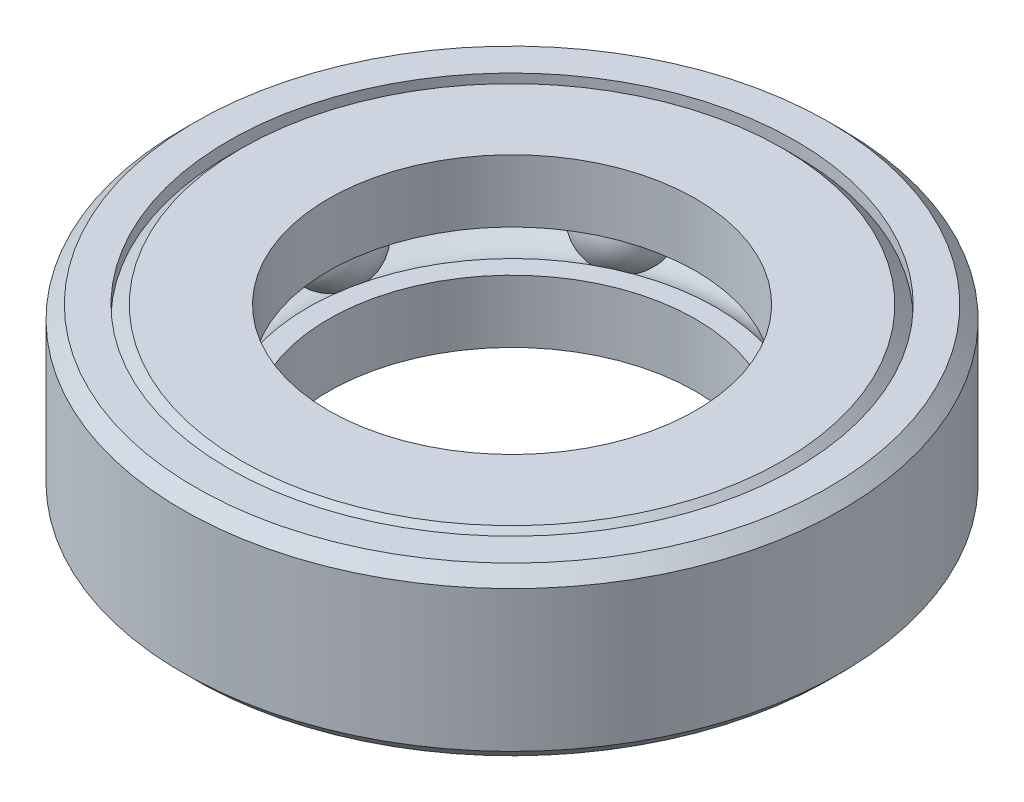
ISO-10303-21;
HEADER;
FILE_DESCRIPTION(('STEP AP214'),'2;1');
FILE_NAME('part.step','',(''),(''),'','','');
FILE_SCHEMA(('AUTOMOTIVE_DESIGN { 1 0 10303 214 1 1 1 1 }'));
ENDSEC;
DATA;
#1=APPLICATION_CONTEXT('core data for automotive mechanical design processes');
#2=APPLICATION_PROTOCOL_DEFINITION('international standard','automotive_design',2000,#1);
#3=PRODUCT_CONTEXT('',#1,'mechanical');
#4=PRODUCT('Part','Part','',(#3));
#5=PRODUCT_RELATED_PRODUCT_CATEGORY('part','',(#4));
#6=PRODUCT_DEFINITION_FORMATION('','',#4);
#7=PRODUCT_DEFINITION_CONTEXT('part definition',#1,'design');
#8=PRODUCT_DEFINITION('design','',#6,#7);
#9=PRODUCT_DEFINITION_SHAPE('','',#8);
#10=(LENGTH_UNIT() NAMED_UNIT(*) SI_UNIT(.MILLI.,.METRE.));
#11=(NAMED_UNIT(*) PLANE_ANGLE_UNIT() SI_UNIT($,.RADIAN.));
#12=(NAMED_UNIT(*) SI_UNIT($,.STERADIAN.) SOLID_ANGLE_UNIT());
#13=UNCERTAINTY_MEASURE_WITH_UNIT(LENGTH_MEASURE(1.E-05),#10,'distance_accuracy_value','');
#14=(GEOMETRIC_REPRESENTATION_CONTEXT(3) GLOBAL_UNCERTAINTY_ASSIGNED_CONTEXT((#13)) GLOBAL_UNIT_ASSIGNED_CONTEXT((#10,
#11,#12)) REPRESENTATION_CONTEXT('',''));
#15=CARTESIAN_POINT('',(0.,0.,0.));
#16=DIRECTION('',(0.,0.,1.));
#17=DIRECTION('',(1.,0.,0.));
#18=AXIS2_PLACEMENT_3D('',#15,#16,#17);
#19=CARTESIAN_POINT('',(17.8571532207388,0.,14.2406044947352));
#20=DIRECTION('',(0.,1.,0.));
#21=DIRECTION('',(-0.781831482468022,0.,-0.623489801858743));
#22=AXIS2_PLACEMENT_3D('',#19,#20,#21);
#23=SPHERICAL_SURFACE('',#22,3.96875);
#24=CARTESIAN_POINT('',(17.8571532207388,3.96875,14.2406044947352));
#25=VERTEX_POINT('',#24);
#26=VERTEX_LOOP('',#25);
#27=FACE_BOUND('',#26,.T.);
#28=ADVANCED_FACE('F35',(#27),#23,.T.);
#29=CLOSED_SHELL('',(#28));
#30=MANIFOLD_SOLID_BREP('B2',#29);
#31=CARTESIAN_POINT('',(22.2675058467192,0.,-5.08241290045794));
#32=DIRECTION('',(0.,1.,0.));
#33=DIRECTION('',(-0.974927912181826,0.,0.222520933956305));
#34=AXIS2_PLACEMENT_3D('',#31,#32,#33);
#35=SPHERICAL_SURFACE('',#34,3.96875);
#36=CARTESIAN_POINT('',(22.2675058467192,3.96875,-5.08241290045794));
#37=VERTEX_POINT('',#36);
#38=VERTEX_LOOP('',#37);
#39=FACE_BOUND('',#38,.T.);
#40=ADVANCED_FACE('F53',(#39),#35,.T.);
#41=CLOSED_SHELL('',(#40));
#42=MANIFOLD_SOLID_BREP('B6',#41);
#43=CARTESIAN_POINT('',(9.90997239577943,0.,-20.5782697192768));
#44=DIRECTION('',(0.,1.,0.));
#45=DIRECTION('',(-0.433883739117565,0.,0.900968867902416));
#46=AXIS2_PLACEMENT_3D('',#43,#44,#45);
#47=SPHERICAL_SURFACE('',#46,3.96875);
#48=CARTESIAN_POINT('',(9.90997239577943,3.96875000000001,-20.5782697192768));
#49=VERTEX_POINT('',#48);
#50=VERTEX_LOOP('',#49);
#51=FACE_BOUND('',#50,.T.);
#52=ADVANCED_FACE('F71',(#51),#47,.T.);
#53=CLOSED_SHELL('',(#52));
#54=MANIFOLD_SOLID_BREP('B31',#53);
#55=CARTESIAN_POINT('',(-9.90997239577914,0.,-20.5782697192769));
#56=DIRECTION('',(0.,1.,0.));
#57=DIRECTION('',(0.433883739117553,0.,0.900968867902422));
#58=AXIS2_PLACEMENT_3D('',#55,#56,#57);
#59=SPHERICAL_SURFACE('',#58,3.96875);
#60=CARTESIAN_POINT('',(-9.90997239577914,3.96875000000001,-20.5782697192769));
#61=VERTEX_POINT('',#60);
#62=VERTEX_LOOP('',#61);
#63=FACE_BOUND('',#62,.T.);
#64=ADVANCED_FACE('F89',(#63),#59,.T.);
#65=CLOSED_SHELL('',(#64));
#66=MANIFOLD_SOLID_BREP('B49',#65);
#67=CARTESIAN_POINT('',(-22.2675058467191,0.,-5.08241290045824));
#68=DIRECTION('',(0.,1.,0.));
#69=DIRECTION('',(0.974927912181823,0.,0.222520933956318));
#70=AXIS2_PLACEMENT_3D('',#67,#68,#69);
#71=SPHERICAL_SURFACE('',#70,3.96875);
#72=CARTESIAN_POINT('',(-22.2675058467191,3.96875,-5.08241290045824));
#73=VERTEX_POINT('',#72);
#74=VERTEX_LOOP('',#73);
#75=FACE_BOUND('',#74,.T.);
#76=ADVANCED_FACE('F107',(#75),#71,.T.);
#77=CLOSED_SHELL('',(#76));
#78=MANIFOLD_SOLID_BREP('B67',#77);
#79=CARTESIAN_POINT('',(-17.857153220739,0.,14.240604494735));
#80=DIRECTION('',(0.,1.,0.));
#81=DIRECTION('',(0.781831482468031,0.,-0.623489801858732));
#82=AXIS2_PLACEMENT_3D('',#79,#80,#81);
#83=SPHERICAL_SURFACE('',#82,3.96875);
#84=CARTESIAN_POINT('',(-17.857153220739,3.96875,14.240604494735));
#85=VERTEX_POINT('',#84);
#86=VERTEX_LOOP('',#85);
#87=FACE_BOUND('',#86,.T.);
#88=ADVANCED_FACE('F125',(#87),#83,.T.);
#89=CLOSED_SHELL('',(#88));
#90=MANIFOLD_SOLID_BREP('B85',#89);
#91=CARTESIAN_POINT('',(0.,0.,22.84015625));
#92=DIRECTION('',(0.,1.,0.));
#93=DIRECTION('',(0.,0.,-1.));
#94=AXIS2_PLACEMENT_3D('',#91,#92,#93);
#95=SPHERICAL_SURFACE('',#94,3.96875);
#96=CARTESIAN_POINT('',(0.,3.96875,22.84015625));
#97=VERTEX_POINT('',#96);
#98=VERTEX_LOOP('',#97);
#99=FACE_BOUND('',#98,.T.);
#100=ADVANCED_FACE('F145',(#99),#95,.T.);
#101=CLOSED_SHELL('',(#100));
#102=MANIFOLD_SOLID_BREP('B103',#101);
#103=CARTESIAN_POINT('',(0.,5.47163488649767,0.));
#104=DIRECTION('',(0.,-1.,0.));
#105=DIRECTION('',(0.,0.,-1.));
#106=AXIS2_PLACEMENT_3D('',#103,#104,#105);
#107=CONICAL_SURFACE('',#106,28.2178125,0.785398163397453);
#108=CARTESIAN_POINT('',(0.,6.70456744324884,0.));
#109=DIRECTION('',(0.,-1.,0.));
#110=DIRECTION('',(0.,0.,-1.));
#111=AXIS2_PLACEMENT_3D('',#108,#109,#110);
#112=CIRCLE('',#111,26.9848799432488);
#113=CARTESIAN_POINT('',(0.,6.70456744324884,-26.9848799432488));
#114=VERTEX_POINT('',#113);
#115=EDGE_CURVE('E144',#114,#114,#112,.T.);
#116=ORIENTED_EDGE('',*,*,#115,.F.);
#117=EDGE_LOOP('',(#116));
#118=FACE_BOUND('',#117,.T.);
#119=CARTESIAN_POINT('',(0.,5.47163488649767,0.));
#120=DIRECTION('',(0.,-1.,0.));
#121=DIRECTION('',(0.,0.,-1.));
#122=AXIS2_PLACEMENT_3D('',#119,#120,#121);
#123=CIRCLE('',#122,28.2178125);
#124=CARTESIAN_POINT('',(0.,5.47163488649768,-28.2178125));
#125=VERTEX_POINT('',#124);
#126=EDGE_CURVE('E199',#125,#125,#123,.T.);
#127=ORIENTED_EDGE('',*,*,#126,.T.);
#128=EDGE_LOOP('',(#127));
#129=FACE_BOUND('',#128,.T.);
#130=ADVANCED_FACE('F165',(#118,#129),#107,.F.);
#131=CARTESIAN_POINT('',(0.,-7.93750000000001,0.));
#132=DIRECTION('',(0.,-1.,0.));
#133=DIRECTION('',(0.,0.,-1.));
#134=AXIS2_PLACEMENT_3D('',#131,#132,#133);
#135=CYLINDRICAL_SURFACE('',#134,26.9848799432488);
#136=CARTESIAN_POINT('',(0.,7.9375,0.));
#137=DIRECTION('',(0.,-1.,0.));
#138=DIRECTION('',(0.,0.,-1.));
#139=AXIS2_PLACEMENT_3D('',#136,#137,#138);
#140=CIRCLE('',#139,26.9848799432488);
#141=CARTESIAN_POINT('',(0.,7.93750000000001,-26.9848799432488));
#142=VERTEX_POINT('',#141);
#143=EDGE_CURVE('E171',#142,#142,#140,.T.);
#144=ORIENTED_EDGE('',*,*,#143,.F.);
#145=EDGE_LOOP('',(#144));
#146=FACE_BOUND('',#145,.T.);
#147=ORIENTED_EDGE('',*,*,#115,.T.);
#148=EDGE_LOOP('',(#147));
#149=FACE_BOUND('',#148,.T.);
#150=ADVANCED_FACE('F248',(#146,#149),#135,.F.);
#151=CARTESIAN_POINT('',(0.,7.9375,30.1201924432488));
#152=DIRECTION('',(0.,-1.,0.));
#153=DIRECTION('',(0.,0.,-1.));
#154=AXIS2_PLACEMENT_3D('',#151,#152,#153);
#155=PLANE('',#154);
#156=CARTESIAN_POINT('',(0.,7.93750000000001,0.));
#157=DIRECTION('',(0.,-1.,0.));
#158=DIRECTION('',(0.,0.,-1.));
#159=AXIS2_PLACEMENT_3D('',#156,#157,#158);
#160=CIRCLE('',#159,30.1201924432488);
#161=CARTESIAN_POINT('',(0.,7.93750000000001,-30.1201924432488));
#162=VERTEX_POINT('',#161);
#163=EDGE_CURVE('E175',#162,#162,#160,.T.);
#164=ORIENTED_EDGE('',*,*,#163,.F.);
#165=EDGE_LOOP('',(#164));
#166=FACE_BOUND('',#165,.T.);
#167=ORIENTED_EDGE('',*,*,#143,.T.);
#168=EDGE_LOOP('',(#167));
#169=FACE_BOUND('',#168,.T.);
#170=ADVANCED_FACE('F243',(#166,#169),#155,.F.);
#171=CARTESIAN_POINT('',(0.,7.93750000000001,0.));
#172=DIRECTION('',(0.,-1.,0.));
#173=DIRECTION('',(0.,0.,-1.));
#174=AXIS2_PLACEMENT_3D('',#171,#172,#173);
#175=CONICAL_SURFACE('',#174,30.1201924432488,0.785398163397455);
#176=CARTESIAN_POINT('',(0.,6.70456744324884,0.));
#177=DIRECTION('',(0.,-1.,0.));
#178=DIRECTION('',(0.,0.,-1.));
#179=AXIS2_PLACEMENT_3D('',#176,#177,#178);
#180=CIRCLE('',#179,31.353125);
#181=CARTESIAN_POINT('',(0.,6.70456744324884,-31.353125));
#182=VERTEX_POINT('',#181);
#183=EDGE_CURVE('E179',#182,#182,#180,.T.);
#184=ORIENTED_EDGE('',*,*,#183,.F.);
#185=EDGE_LOOP('',(#184));
#186=FACE_BOUND('',#185,.T.);
#187=ORIENTED_EDGE('',*,*,#163,.T.);
#188=EDGE_LOOP('',(#187));
#189=FACE_BOUND('',#188,.T.);
#190=ADVANCED_FACE('F237',(#186,#189),#175,.T.);
#191=CARTESIAN_POINT('',(0.,-7.93750000000001,0.));
#192=DIRECTION('',(0.,-1.,0.));
#193=DIRECTION('',(0.,0.,-1.));
#194=AXIS2_PLACEMENT_3D('',#191,#192,#193);
#195=CYLINDRICAL_SURFACE('',#194,31.353125);
#196=CARTESIAN_POINT('',(0.,-6.70456744324885,0.));
#197=DIRECTION('',(0.,-1.,0.));
#198=DIRECTION('',(0.,0.,-1.));
#199=AXIS2_PLACEMENT_3D('',#196,#197,#198);
#200=CIRCLE('',#199,31.353125);
#201=CARTESIAN_POINT('',(0.,-6.70456744324885,-31.353125));
#202=VERTEX_POINT('',#201);
#203=EDGE_CURVE('E184',#202,#202,#200,.T.);
#204=ORIENTED_EDGE('',*,*,#203,.F.);
#205=EDGE_LOOP('',(#204));
#206=FACE_BOUND('',#205,.T.);
#207=ORIENTED_EDGE('',*,*,#183,.T.);
#208=EDGE_LOOP('',(#207));
#209=FACE_BOUND('',#208,.T.);
#210=ADVANCED_FACE('F231',(#206,#209),#195,.T.);
#211=CARTESIAN_POINT('',(0.,-6.70456744324885,0.));
#212=DIRECTION('',(0.,1.,0.));
#213=DIRECTION('',(0.,0.,1.));
#214=AXIS2_PLACEMENT_3D('',#211,#212,#213);
#215=CONICAL_SURFACE('',#214,31.353125,0.785398163397455);
#216=CARTESIAN_POINT('',(0.,-7.93750000000002,0.));
#217=DIRECTION('',(0.,-1.,0.));
#218=DIRECTION('',(0.,0.,-1.));
#219=AXIS2_PLACEMENT_3D('',#216,#217,#218);
#220=CIRCLE('',#219,30.1201924432488);
#221=CARTESIAN_POINT('',(0.,-7.93750000000002,-30.1201924432488));
#222=VERTEX_POINT('',#221);
#223=EDGE_CURVE('E187',#222,#222,#220,.T.);
#224=ORIENTED_EDGE('',*,*,#223,.F.);
#225=EDGE_LOOP('',(#224));
#226=FACE_BOUND('',#225,.T.);
#227=ORIENTED_EDGE('',*,*,#203,.T.);
#228=EDGE_LOOP('',(#227));
#229=FACE_BOUND('',#228,.T.);
#230=ADVANCED_FACE('F225',(#226,#229),#215,.T.);
#231=CARTESIAN_POINT('',(0.,-7.93750000000002,30.1201924432488));
#232=DIRECTION('',(0.,1.,0.));
#233=DIRECTION('',(0.,0.,1.));
#234=AXIS2_PLACEMENT_3D('',#231,#232,#233);
#235=PLANE('',#234);
#236=CARTESIAN_POINT('',(0.,-7.93750000000002,0.));
#237=DIRECTION('',(0.,-1.,0.));
#238=DIRECTION('',(0.,0.,-1.));
#239=AXIS2_PLACEMENT_3D('',#236,#237,#238);
#240=CIRCLE('',#239,26.9848799432488);
#241=CARTESIAN_POINT('',(0.,-7.93750000000001,-26.9848799432488));
#242=VERTEX_POINT('',#241);
#243=EDGE_CURVE('E190',#242,#242,#240,.T.);
#244=ORIENTED_EDGE('',*,*,#243,.F.);
#245=EDGE_LOOP('',(#244));
#246=FACE_BOUND('',#245,.T.);
#247=ORIENTED_EDGE('',*,*,#223,.T.);
#248=EDGE_LOOP('',(#247));
#249=FACE_BOUND('',#248,.T.);
#250=ADVANCED_FACE('F219',(#246,#249),#235,.F.);
#251=CARTESIAN_POINT('',(0.,-7.93750000000001,0.));
#252=DIRECTION('',(0.,-1.,0.));
#253=DIRECTION('',(0.,0.,-1.));
#254=AXIS2_PLACEMENT_3D('',#251,#252,#253);
#255=CYLINDRICAL_SURFACE('',#254,26.9848799432488);
#256=CARTESIAN_POINT('',(0.,-6.70456744324885,0.));
#257=DIRECTION('',(0.,-1.,0.));
#258=DIRECTION('',(0.,0.,-1.));
#259=AXIS2_PLACEMENT_3D('',#256,#257,#258);
#260=CIRCLE('',#259,26.9848799432488);
#261=CARTESIAN_POINT('',(0.,-6.70456744324885,-26.9848799432488));
#262=VERTEX_POINT('',#261);
#263=EDGE_CURVE('E193',#262,#262,#260,.T.);
#264=ORIENTED_EDGE('',*,*,#263,.F.);
#265=EDGE_LOOP('',(#264));
#266=FACE_BOUND('',#265,.T.);
#267=ORIENTED_EDGE('',*,*,#243,.T.);
#268=EDGE_LOOP('',(#267));
#269=FACE_BOUND('',#268,.T.);
#270=ADVANCED_FACE('F213',(#266,#269),#255,.F.);
#271=CARTESIAN_POINT('',(0.,-6.70456744324885,0.));
#272=DIRECTION('',(0.,1.,0.));
#273=DIRECTION('',(0.,0.,1.));
#274=AXIS2_PLACEMENT_3D('',#271,#272,#273);
#275=CONICAL_SURFACE('',#274,26.9848799432488,0.785398163397447);
#276=CARTESIAN_POINT('',(0.,-5.47163488649768,0.));
#277=DIRECTION('',(0.,-1.,0.));
#278=DIRECTION('',(0.,0.,-1.));
#279=AXIS2_PLACEMENT_3D('',#276,#277,#278);
#280=CIRCLE('',#279,28.2178125);
#281=CARTESIAN_POINT('',(0.,-5.47163488649767,-28.2178125));
#282=VERTEX_POINT('',#281);
#283=EDGE_CURVE('E196',#282,#282,#280,.T.);
#284=ORIENTED_EDGE('',*,*,#283,.F.);
#285=EDGE_LOOP('',(#284));
#286=FACE_BOUND('',#285,.T.);
#287=ORIENTED_EDGE('',*,*,#263,.T.);
#288=EDGE_LOOP('',(#287));
#289=FACE_BOUND('',#288,.T.);
#290=ADVANCED_FACE('F207',(#286,#289),#275,.F.);
#291=CARTESIAN_POINT('',(0.,-7.93750000000001,0.));
#292=DIRECTION('',(0.,-1.,0.));
#293=DIRECTION('',(0.,0.,-1.));
#294=AXIS2_PLACEMENT_3D('',#291,#292,#293);
#295=CYLINDRICAL_SURFACE('',#294,28.2178125);
#296=ORIENTED_EDGE('',*,*,#126,.F.);
#297=EDGE_LOOP('',(#296));
#298=FACE_BOUND('',#297,.T.);
#299=ORIENTED_EDGE('',*,*,#283,.T.);
#300=EDGE_LOOP('',(#299));
#301=FACE_BOUND('',#300,.T.);
#302=ADVANCED_FACE('F204',(#298,#301),#295,.F.);
#303=CLOSED_SHELL('',(#130,#150,#170,#190,#210,#230,#250,#270,#290,#302));
#304=MANIFOLD_SOLID_BREP('B121',#303);
#305=CARTESIAN_POINT('',(0.,0.,0.));
#306=DIRECTION('',(0.,-1.,0.));
#307=DIRECTION('',(0.,0.,-1.));
#308=AXIS2_PLACEMENT_3D('',#305,#306,#307);
#309=TOROIDAL_SURFACE('',#308,22.84015625,3.96875000000001);
#310=CARTESIAN_POINT('',(0.,-1.98437500000002,0.));
#311=DIRECTION('',(0.,-1.,0.));
#312=DIRECTION('',(0.,0.,-1.));
#313=AXIS2_PLACEMENT_3D('',#310,#311,#312);
#314=CIRCLE('',#313,26.2771945712695);
#315=CARTESIAN_POINT('',(0.,-1.98437500000001,-26.2771945712695));
#316=VERTEX_POINT('',#315);
#317=EDGE_CURVE('E164',#316,#316,#314,.T.);
#318=ORIENTED_EDGE('',*,*,#317,.F.);
#319=EDGE_LOOP('',(#318));
#320=FACE_BOUND('',#319,.T.);
#321=CARTESIAN_POINT('',(0.,-1.98437500000002,0.));
#322=DIRECTION('',(0.,-1.,0.));
#323=DIRECTION('',(0.,0.,-1.));
#324=AXIS2_PLACEMENT_3D('',#321,#322,#323);
#325=CIRCLE('',#324,19.4031179287305);
#326=CARTESIAN_POINT('',(0.,-1.98437500000001,-19.4031179287305));
#327=VERTEX_POINT('',#326);
#328=EDGE_CURVE('E348',#327,#327,#325,.T.);
#329=ORIENTED_EDGE('',*,*,#328,.T.);
#330=EDGE_LOOP('',(#329));
#331=FACE_BOUND('',#330,.T.);
#332=ADVANCED_FACE('F323',(#320,#331),#309,.F.);
#333=CARTESIAN_POINT('',(0.,-1.98437500000002,26.2771945712695));
#334=DIRECTION('',(0.,-1.,0.));
#335=DIRECTION('',(0.,0.,-1.));
#336=AXIS2_PLACEMENT_3D('',#333,#334,#335);
#337=PLANE('',#336);
#338=CARTESIAN_POINT('',(0.,-1.98437500000002,0.));
#339=DIRECTION('',(0.,-1.,0.));
#340=DIRECTION('',(0.,0.,-1.));
#341=AXIS2_PLACEMENT_3D('',#338,#339,#340);
#342=CIRCLE('',#341,28.2178125);
#343=CARTESIAN_POINT('',(0.,-1.98437500000001,-28.2178125));
#344=VERTEX_POINT('',#343);
#345=EDGE_CURVE('E329',#344,#344,#342,.T.);
#346=ORIENTED_EDGE('',*,*,#345,.F.);
#347=EDGE_LOOP('',(#346));
#348=FACE_BOUND('',#347,.T.);
#349=ORIENTED_EDGE('',*,*,#317,.T.);
#350=EDGE_LOOP('',(#349));
#351=FACE_BOUND('',#350,.T.);
#352=ADVANCED_FACE('F379',(#348,#351),#337,.F.);
#353=CARTESIAN_POINT('',(0.,-7.93750000000001,0.));
#354=DIRECTION('',(0.,-1.,0.));
#355=DIRECTION('',(0.,0.,-1.));
#356=AXIS2_PLACEMENT_3D('',#353,#354,#355);
#357=CYLINDRICAL_SURFACE('',#356,28.2178125);
#358=CARTESIAN_POINT('',(0.,-5.47163488649769,0.));
#359=DIRECTION('',(0.,-1.,0.));
#360=DIRECTION('',(0.,0.,-1.));
#361=AXIS2_PLACEMENT_3D('',#358,#359,#360);
#362=CIRCLE('',#361,28.2178125);
#363=CARTESIAN_POINT('',(0.,-5.47163488649769,-28.2178125));
#364=VERTEX_POINT('',#363);
#365=EDGE_CURVE('E333',#364,#364,#362,.T.);
#366=ORIENTED_EDGE('',*,*,#365,.F.);
#367=EDGE_LOOP('',(#366));
#368=FACE_BOUND('',#367,.T.);
#369=ORIENTED_EDGE('',*,*,#345,.T.);
#370=EDGE_LOOP('',(#369));
#371=FACE_BOUND('',#370,.T.);
#372=ADVANCED_FACE('F374',(#368,#371),#357,.T.);
#373=CARTESIAN_POINT('',(0.,-5.47163488649769,0.));
#374=DIRECTION('',(0.,1.,0.));
#375=DIRECTION('',(0.,0.,1.));
#376=AXIS2_PLACEMENT_3D('',#373,#374,#375);
#377=CONICAL_SURFACE('',#376,28.2178125,0.78539816339745);
#378=CARTESIAN_POINT('',(0.,-7.93750000000002,0.));
#379=DIRECTION('',(0.,-1.,0.));
#380=DIRECTION('',(0.,0.,-1.));
#381=AXIS2_PLACEMENT_3D('',#378,#379,#380);
#382=CIRCLE('',#381,25.7519473864977);
#383=CARTESIAN_POINT('',(0.,-7.93750000000001,-25.7519473864977));
#384=VERTEX_POINT('',#383);
#385=EDGE_CURVE('E337',#384,#384,#382,.T.);
#386=ORIENTED_EDGE('',*,*,#385,.F.);
#387=EDGE_LOOP('',(#386));
#388=FACE_BOUND('',#387,.T.);
#389=ORIENTED_EDGE('',*,*,#365,.T.);
#390=EDGE_LOOP('',(#389));
#391=FACE_BOUND('',#390,.T.);
#392=ADVANCED_FACE('F368',(#388,#391),#377,.T.);
#393=CARTESIAN_POINT('',(0.,-7.93750000000002,25.7519473864977));
#394=DIRECTION('',(0.,1.,0.));
#395=DIRECTION('',(0.,0.,1.));
#396=AXIS2_PLACEMENT_3D('',#393,#394,#395);
#397=PLANE('',#396);
#398=CARTESIAN_POINT('',(0.,-7.93750000000001,0.));
#399=DIRECTION('',(0.,-1.,0.));
#400=DIRECTION('',(0.,0.,-1.));
#401=AXIS2_PLACEMENT_3D('',#398,#399,#400);
#402=CIRCLE('',#401,17.4625);
#403=CARTESIAN_POINT('',(0.,-7.93750000000001,-17.4625));
#404=VERTEX_POINT('',#403);
#405=EDGE_CURVE('E342',#404,#404,#402,.T.);
#406=ORIENTED_EDGE('',*,*,#405,.F.);
#407=EDGE_LOOP('',(#406));
#408=FACE_BOUND('',#407,.T.);
#409=ORIENTED_EDGE('',*,*,#385,.T.);
#410=EDGE_LOOP('',(#409));
#411=FACE_BOUND('',#410,.T.);
#412=ADVANCED_FACE('F362',(#408,#411),#397,.F.);
#413=CARTESIAN_POINT('',(0.,-7.93750000000001,0.));
#414=DIRECTION('',(0.,-1.,0.));
#415=DIRECTION('',(0.,0.,-1.));
#416=AXIS2_PLACEMENT_3D('',#413,#414,#415);
#417=CYLINDRICAL_SURFACE('',#416,17.4625);
#418=CARTESIAN_POINT('',(0.,-1.98437500000002,0.));
#419=DIRECTION('',(0.,-1.,0.));
#420=DIRECTION('',(0.,0.,-1.));
#421=AXIS2_PLACEMENT_3D('',#418,#419,#420);
#422=CIRCLE('',#421,17.4625);
#423=CARTESIAN_POINT('',(0.,-1.98437500000001,-17.4625));
#424=VERTEX_POINT('',#423);
#425=EDGE_CURVE('E345',#424,#424,#422,.T.);
#426=ORIENTED_EDGE('',*,*,#425,.F.);
#427=EDGE_LOOP('',(#426));
#428=FACE_BOUND('',#427,.T.);
#429=ORIENTED_EDGE('',*,*,#405,.T.);
#430=EDGE_LOOP('',(#429));
#431=FACE_BOUND('',#430,.T.);
#432=ADVANCED_FACE('F356',(#428,#431),#417,.F.);
#433=CARTESIAN_POINT('',(0.,-1.98437500000002,17.4625));
#434=DIRECTION('',(0.,-1.,0.));
#435=DIRECTION('',(0.,0.,-1.));
#436=AXIS2_PLACEMENT_3D('',#433,#434,#435);
#437=PLANE('',#436);
#438=ORIENTED_EDGE('',*,*,#328,.F.);
#439=EDGE_LOOP('',(#438));
#440=FACE_BOUND('',#439,.T.);
#441=ORIENTED_EDGE('',*,*,#425,.T.);
#442=EDGE_LOOP('',(#441));
#443=FACE_BOUND('',#442,.T.);
#444=ADVANCED_FACE('F353',(#440,#443),#437,.F.);
#445=CLOSED_SHELL('',(#332,#352,#372,#392,#412,#432,#444));
#446=MANIFOLD_SOLID_BREP('B139',#445);
#447=CARTESIAN_POINT('',(0.,0.,0.));
#448=DIRECTION('',(0.,-1.,0.));
#449=DIRECTION('',(0.,0.,-1.));
#450=AXIS2_PLACEMENT_3D('',#447,#448,#449);
#451=TOROIDAL_SURFACE('',#450,22.84015625,3.96875);
#452=CARTESIAN_POINT('',(0.,1.984375,0.));
#453=DIRECTION('',(0.,-1.,0.));
#454=DIRECTION('',(0.,0.,-1.));
#455=AXIS2_PLACEMENT_3D('',#452,#453,#454);
#456=CIRCLE('',#455,19.4031179287305);
#457=CARTESIAN_POINT('',(0.,1.984375,-19.4031179287305));
#458=VERTEX_POINT('',#457);
#459=EDGE_CURVE('E454',#458,#458,#456,.T.);
#460=ORIENTED_EDGE('',*,*,#459,.F.);
#461=EDGE_LOOP('',(#460));
#462=FACE_BOUND('',#461,.T.);
#463=CARTESIAN_POINT('',(0.,1.984375,0.));
#464=DIRECTION('',(0.,-1.,0.));
#465=DIRECTION('',(0.,0.,-1.));
#466=AXIS2_PLACEMENT_3D('',#463,#464,#465);
#467=CIRCLE('',#466,26.2771945712695);
#468=CARTESIAN_POINT('',(0.,1.984375,-26.2771945712695));
#469=VERTEX_POINT('',#468);
#470=EDGE_CURVE('E322',#469,#469,#467,.T.);
#471=ORIENTED_EDGE('',*,*,#470,.T.);
#472=EDGE_LOOP('',(#471));
#473=FACE_BOUND('',#472,.T.);
#474=ADVANCED_FACE('F429',(#462,#473),#451,.F.);
#475=CARTESIAN_POINT('',(0.,1.984375,26.2771945712695));
#476=DIRECTION('',(0.,1.,0.));
#477=DIRECTION('',(0.,0.,1.));
#478=AXIS2_PLACEMENT_3D('',#475,#476,#477);
#479=PLANE('',#478);
#480=ORIENTED_EDGE('',*,*,#470,.F.);
#481=EDGE_LOOP('',(#480));
#482=FACE_BOUND('',#481,.T.);
#483=CARTESIAN_POINT('',(0.,1.984375,0.));
#484=DIRECTION('',(0.,-1.,0.));
#485=DIRECTION('',(0.,0.,-1.));
#486=AXIS2_PLACEMENT_3D('',#483,#484,#485);
#487=CIRCLE('',#486,28.2178125);
#488=CARTESIAN_POINT('',(0.,1.98437500000001,-28.2178125));
#489=VERTEX_POINT('',#488);
#490=EDGE_CURVE('E435',#489,#489,#487,.T.);
#491=ORIENTED_EDGE('',*,*,#490,.T.);
#492=EDGE_LOOP('',(#491));
#493=FACE_BOUND('',#492,.T.);
#494=ADVANCED_FACE('F461',(#482,#493),#479,.F.);
#495=CARTESIAN_POINT('',(0.,-7.93750000000001,0.));
#496=DIRECTION('',(0.,-1.,0.));
#497=DIRECTION('',(0.,0.,-1.));
#498=AXIS2_PLACEMENT_3D('',#495,#496,#497);
#499=CYLINDRICAL_SURFACE('',#498,28.2178125);
#500=ORIENTED_EDGE('',*,*,#490,.F.);
#501=EDGE_LOOP('',(#500));
#502=FACE_BOUND('',#501,.T.);
#503=CARTESIAN_POINT('',(0.,5.47163488649767,0.));
#504=DIRECTION('',(0.,-1.,0.));
#505=DIRECTION('',(0.,0.,-1.));
#506=AXIS2_PLACEMENT_3D('',#503,#504,#505);
#507=CIRCLE('',#506,28.2178125);
#508=CARTESIAN_POINT('',(0.,5.47163488649768,-28.2178125));
#509=VERTEX_POINT('',#508);
#510=EDGE_CURVE('E439',#509,#509,#507,.T.);
#511=ORIENTED_EDGE('',*,*,#510,.T.);
#512=EDGE_LOOP('',(#511));
#513=FACE_BOUND('',#512,.T.);
#514=ADVANCED_FACE('F465',(#502,#513),#499,.T.);
#515=CARTESIAN_POINT('',(0.,7.9375,0.));
#516=DIRECTION('',(0.,-1.,0.));
#517=DIRECTION('',(0.,0.,-1.));
#518=AXIS2_PLACEMENT_3D('',#515,#516,#517);
#519=CONICAL_SURFACE('',#518,25.7519473864977,0.785398163397451);
#520=ORIENTED_EDGE('',*,*,#510,.F.);
#521=EDGE_LOOP('',(#520));
#522=FACE_BOUND('',#521,.T.);
#523=CARTESIAN_POINT('',(0.,7.9375,0.));
#524=DIRECTION('',(0.,-1.,0.));
#525=DIRECTION('',(0.,0.,-1.));
#526=AXIS2_PLACEMENT_3D('',#523,#524,#525);
#527=CIRCLE('',#526,25.7519473864977);
#528=CARTESIAN_POINT('',(0.,7.93750000000001,-25.7519473864977));
#529=VERTEX_POINT('',#528);
#530=EDGE_CURVE('E443',#529,#529,#527,.T.);
#531=ORIENTED_EDGE('',*,*,#530,.T.);
#532=EDGE_LOOP('',(#531));
#533=FACE_BOUND('',#532,.T.);
#534=ADVANCED_FACE('F470',(#522,#533),#519,.T.);
#535=CARTESIAN_POINT('',(0.,7.9375,25.7519473864977));
#536=DIRECTION('',(0.,-1.,0.));
#537=DIRECTION('',(0.,0.,-1.));
#538=AXIS2_PLACEMENT_3D('',#535,#536,#537);
#539=PLANE('',#538);
#540=ORIENTED_EDGE('',*,*,#530,.F.);
#541=EDGE_LOOP('',(#540));
#542=FACE_BOUND('',#541,.T.);
#543=CARTESIAN_POINT('',(0.,7.9375,0.));
#544=DIRECTION('',(0.,-1.,0.));
#545=DIRECTION('',(0.,0.,-1.));
#546=AXIS2_PLACEMENT_3D('',#543,#544,#545);
#547=CIRCLE('',#546,17.4625);
#548=CARTESIAN_POINT('',(0.,7.9375,-17.4625));
#549=VERTEX_POINT('',#548);
#550=EDGE_CURVE('E448',#549,#549,#547,.T.);
#551=ORIENTED_EDGE('',*,*,#550,.T.);
#552=EDGE_LOOP('',(#551));
#553=FACE_BOUND('',#552,.T.);
#554=ADVANCED_FACE('F476',(#542,#553),#539,.F.);
#555=CARTESIAN_POINT('',(0.,-7.93750000000001,0.));
#556=DIRECTION('',(0.,-1.,0.));
#557=DIRECTION('',(0.,0.,-1.));
#558=AXIS2_PLACEMENT_3D('',#555,#556,#557);
#559=CYLINDRICAL_SURFACE('',#558,17.4625);
#560=ORIENTED_EDGE('',*,*,#550,.F.);
#561=EDGE_LOOP('',(#560));
#562=FACE_BOUND('',#561,.T.);
#563=CARTESIAN_POINT('',(0.,1.984375,0.));
#564=DIRECTION('',(0.,-1.,0.));
#565=DIRECTION('',(0.,0.,-1.));
#566=AXIS2_PLACEMENT_3D('',#563,#564,#565);
#567=CIRCLE('',#566,17.4625);
#568=CARTESIAN_POINT('',(0.,1.984375,-17.4625));
#569=VERTEX_POINT('',#568);
#570=EDGE_CURVE('E451',#569,#569,#567,.T.);
#571=ORIENTED_EDGE('',*,*,#570,.T.);
#572=EDGE_LOOP('',(#571));
#573=FACE_BOUND('',#572,.T.);
#574=ADVANCED_FACE('F480',(#562,#573),#559,.F.);
#575=CARTESIAN_POINT('',(0.,1.984375,17.4625));
#576=DIRECTION('',(0.,1.,0.));
#577=DIRECTION('',(0.,0.,1.));
#578=AXIS2_PLACEMENT_3D('',#575,#576,#577);
#579=PLANE('',#578);
#580=ORIENTED_EDGE('',*,*,#570,.F.);
#581=EDGE_LOOP('',(#580));
#582=FACE_BOUND('',#581,.T.);
#583=ORIENTED_EDGE('',*,*,#459,.T.);
#584=EDGE_LOOP('',(#583));
#585=FACE_BOUND('',#584,.T.);
#586=ADVANCED_FACE('F458',(#582,#585),#579,.F.);
#587=CLOSED_SHELL('',(#474,#494,#514,#534,#554,#574,#586));
#588=MANIFOLD_SOLID_BREP('B159',#587);
#589=ADVANCED_BREP_SHAPE_REPRESENTATION('',(#18,#30,#42,#54,#66,#78,#90,#102,#304,#446,#588),#14);
#590=SHAPE_DEFINITION_REPRESENTATION(#9,#589);
ENDSEC;
END-ISO-10303-21;
